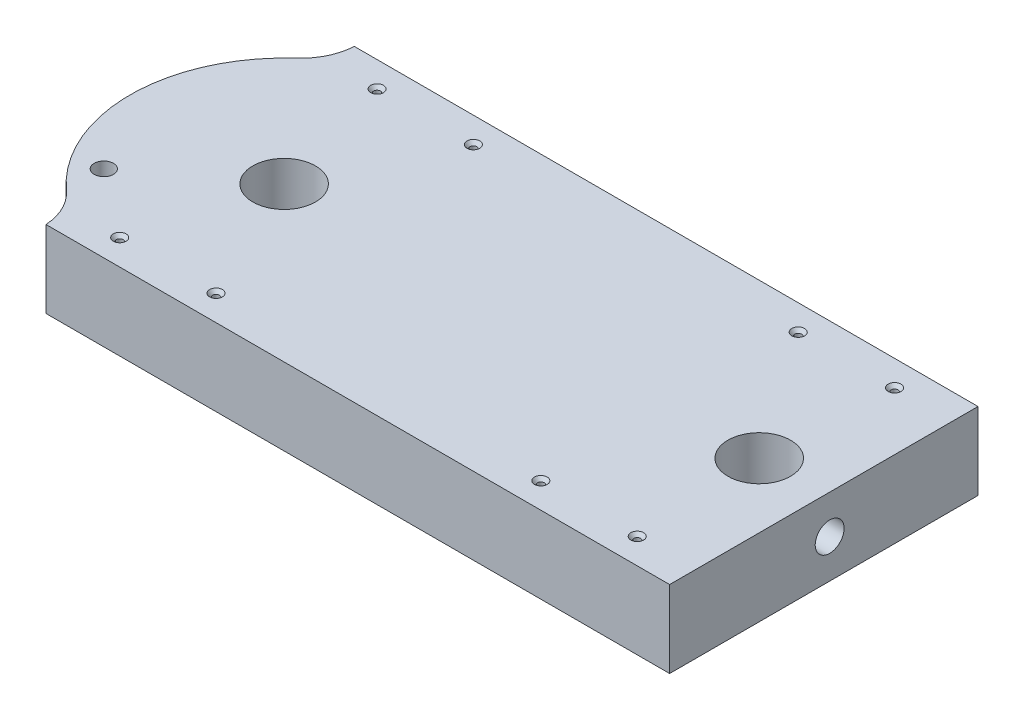
ISO-10303-21;
HEADER;
FILE_DESCRIPTION(('STEP AP214'),'2;1');
FILE_NAME('part.step','',(''),(''),'','','');
FILE_SCHEMA(('AUTOMOTIVE_DESIGN { 1 0 10303 214 1 1 1 1 }'));
ENDSEC;
DATA;
#1=APPLICATION_CONTEXT('core data for automotive mechanical design processes');
#2=APPLICATION_PROTOCOL_DEFINITION('international standard','automotive_design',2000,#1);
#3=PRODUCT_CONTEXT('',#1,'mechanical');
#4=PRODUCT('Part','Part','',(#3));
#5=PRODUCT_RELATED_PRODUCT_CATEGORY('part','',(#4));
#6=PRODUCT_DEFINITION_FORMATION('','',#4);
#7=PRODUCT_DEFINITION_CONTEXT('part definition',#1,'design');
#8=PRODUCT_DEFINITION('design','',#6,#7);
#9=PRODUCT_DEFINITION_SHAPE('','',#8);
#10=(LENGTH_UNIT() NAMED_UNIT(*) SI_UNIT(.MILLI.,.METRE.));
#11=(NAMED_UNIT(*) PLANE_ANGLE_UNIT() SI_UNIT($,.RADIAN.));
#12=(NAMED_UNIT(*) SI_UNIT($,.STERADIAN.) SOLID_ANGLE_UNIT());
#13=UNCERTAINTY_MEASURE_WITH_UNIT(LENGTH_MEASURE(1.E-05),#10,'distance_accuracy_value','');
#14=(GEOMETRIC_REPRESENTATION_CONTEXT(3) GLOBAL_UNCERTAINTY_ASSIGNED_CONTEXT((#13)) GLOBAL_UNIT_ASSIGNED_CONTEXT((#10,
#11,#12)) REPRESENTATION_CONTEXT('',''));
#15=CARTESIAN_POINT('',(0.,0.,0.));
#16=DIRECTION('',(0.,0.,1.));
#17=DIRECTION('',(1.,0.,0.));
#18=AXIS2_PLACEMENT_3D('',#15,#16,#17);
#19=CARTESIAN_POINT('',(-448.948604797529,50.8,205.533286209736));
#20=DIRECTION('',(0.,-1.,0.));
#21=DIRECTION('',(0.,0.,-1.));
#22=AXIS2_PLACEMENT_3D('',#19,#20,#21);
#23=CYLINDRICAL_SURFACE('',#22,38.1);
#24=CARTESIAN_POINT('',(-448.948604797529,0.,205.533286209736));
#25=DIRECTION('',(0.,1.,0.));
#26=DIRECTION('',(0.,0.,1.));
#27=AXIS2_PLACEMENT_3D('',#24,#25,#26);
#28=CIRCLE('',#27,38.1);
#29=CARTESIAN_POINT('',(-410.920118429236,0.,203.2));
#30=VERTEX_POINT('',#29);
#31=CARTESIAN_POINT('',(-423.489894398203,0.,177.187844516171));
#32=VERTEX_POINT('',#31);
#33=EDGE_CURVE('E125',#30,#32,#28,.T.);
#34=ORIENTED_EDGE('',*,*,#33,.F.);
#35=DIRECTION('',(0.,-1.,0.));
#36=VECTOR('',#35,1.);
#37=CARTESIAN_POINT('',(-410.920118429236,50.8,203.2));
#38=LINE('',#37,#36);
#39=CARTESIAN_POINT('',(-410.920118429236,50.8,203.2));
#40=VERTEX_POINT('',#39);
#41=EDGE_CURVE('E11',#40,#30,#38,.T.);
#42=ORIENTED_EDGE('',*,*,#41,.F.);
#43=CARTESIAN_POINT('',(-448.948604797529,50.8,205.533286209736));
#44=DIRECTION('',(0.,1.,0.));
#45=DIRECTION('',(0.,0.,1.));
#46=AXIS2_PLACEMENT_3D('',#43,#44,#45);
#47=CIRCLE('',#46,38.1);
#48=CARTESIAN_POINT('',(-423.489894398203,50.8,177.187844516171));
#49=VERTEX_POINT('',#48);
#50=EDGE_CURVE('E140',#40,#49,#47,.T.);
#51=ORIENTED_EDGE('',*,*,#50,.T.);
#52=DIRECTION('',(0.,-1.,0.));
#53=VECTOR('',#52,1.);
#54=CARTESIAN_POINT('',(-423.489894398203,50.8,177.187844516171));
#55=LINE('',#54,#53);
#56=EDGE_CURVE('E88',#49,#32,#55,.T.);
#57=ORIENTED_EDGE('',*,*,#56,.T.);
#58=EDGE_LOOP('',(#34,#42,#51,#57));
#59=FACE_BOUND('',#58,.T.);
#60=ADVANCED_FACE('F38',(#59),#23,.F.);
#61=CARTESIAN_POINT('',(0.,50.8,203.2));
#62=DIRECTION('',(0.,0.,1.));
#63=DIRECTION('',(1.,0.,0.));
#64=AXIS2_PLACEMENT_3D('',#61,#62,#63);
#65=PLANE('',#64);
#66=DIRECTION('',(-1.,0.,0.));
#67=VECTOR('',#66,1.);
#68=CARTESIAN_POINT('',(0.,0.,203.2));
#69=LINE('',#68,#67);
#70=CARTESIAN_POINT('',(0.,0.,203.2));
#71=VERTEX_POINT('',#70);
#72=EDGE_CURVE('E128',#71,#30,#69,.T.);
#73=ORIENTED_EDGE('',*,*,#72,.F.);
#74=DIRECTION('',(0.,-1.,0.));
#75=VECTOR('',#74,1.);
#76=CARTESIAN_POINT('',(0.,50.8,203.2));
#77=LINE('',#76,#75);
#78=CARTESIAN_POINT('',(0.,50.8,203.2));
#79=VERTEX_POINT('',#78);
#80=EDGE_CURVE('E52',#79,#71,#77,.T.);
#81=ORIENTED_EDGE('',*,*,#80,.F.);
#82=DIRECTION('',(-1.,0.,0.));
#83=VECTOR('',#82,1.);
#84=CARTESIAN_POINT('',(0.,50.8,203.2));
#85=LINE('',#84,#83);
#86=EDGE_CURVE('E154',#79,#40,#85,.T.);
#87=ORIENTED_EDGE('',*,*,#86,.T.);
#88=ORIENTED_EDGE('',*,*,#41,.T.);
#89=EDGE_LOOP('',(#73,#81,#87,#88));
#90=FACE_BOUND('',#89,.T.);
#91=ADVANCED_FACE('F150',(#90),#65,.T.);
#92=CARTESIAN_POINT('',(0.,50.8,0.));
#93=DIRECTION('',(1.,0.,0.));
#94=DIRECTION('',(0.,0.,-1.));
#95=AXIS2_PLACEMENT_3D('',#92,#93,#94);
#96=PLANE('',#95);
#97=CARTESIAN_POINT('',(0.,25.4,97.7392));
#98=DIRECTION('',(1.,0.,0.));
#99=DIRECTION('',(0.,0.,-1.));
#100=AXIS2_PLACEMENT_3D('',#97,#98,#99);
#101=CIRCLE('',#100,9.525);
#102=CARTESIAN_POINT('',(0.,25.4,88.2142));
#103=VERTEX_POINT('',#102);
#104=EDGE_CURVE('E247',#103,#103,#101,.T.);
#105=ORIENTED_EDGE('',*,*,#104,.F.);
#106=EDGE_LOOP('',(#105));
#107=FACE_BOUND('',#106,.T.);
#108=DIRECTION('',(0.,0.,1.));
#109=VECTOR('',#108,1.);
#110=CARTESIAN_POINT('',(0.,0.,0.));
#111=LINE('',#110,#109);
#112=CARTESIAN_POINT('',(0.,0.,0.));
#113=VERTEX_POINT('',#112);
#114=EDGE_CURVE('E132',#113,#71,#111,.T.);
#115=ORIENTED_EDGE('',*,*,#114,.F.);
#116=DIRECTION('',(0.,-1.,0.));
#117=VECTOR('',#116,1.);
#118=CARTESIAN_POINT('',(0.,50.8,0.));
#119=LINE('',#118,#117);
#120=CARTESIAN_POINT('',(0.,50.8,0.));
#121=VERTEX_POINT('',#120);
#122=EDGE_CURVE('E118',#121,#113,#119,.T.);
#123=ORIENTED_EDGE('',*,*,#122,.F.);
#124=DIRECTION('',(0.,0.,1.));
#125=VECTOR('',#124,1.);
#126=CARTESIAN_POINT('',(0.,50.8,0.));
#127=LINE('',#126,#125);
#128=EDGE_CURVE('E107',#121,#79,#127,.T.);
#129=ORIENTED_EDGE('',*,*,#128,.T.);
#130=ORIENTED_EDGE('',*,*,#80,.T.);
#131=EDGE_LOOP('',(#115,#123,#129,#130));
#132=FACE_BOUND('',#131,.T.);
#133=ADVANCED_FACE('F147',(#107,#132),#96,.T.);
#134=CARTESIAN_POINT('',(0.,50.8,0.));
#135=DIRECTION('',(0.,0.,1.));
#136=DIRECTION('',(1.,0.,0.));
#137=AXIS2_PLACEMENT_3D('',#134,#135,#136);
#138=PLANE('',#137);
#139=DIRECTION('',(-1.,0.,0.));
#140=VECTOR('',#139,1.);
#141=CARTESIAN_POINT('',(0.,0.,0.));
#142=LINE('',#141,#140);
#143=CARTESIAN_POINT('',(-410.920118429236,0.,0.));
#144=VERTEX_POINT('',#143);
#145=EDGE_CURVE('E114',#113,#144,#142,.T.);
#146=ORIENTED_EDGE('',*,*,#145,.T.);
#147=DIRECTION('',(0.,-1.,0.));
#148=VECTOR('',#147,1.);
#149=CARTESIAN_POINT('',(-410.920118429236,50.8,0.));
#150=LINE('',#149,#148);
#151=CARTESIAN_POINT('',(-410.920118429236,50.8,0.));
#152=VERTEX_POINT('',#151);
#153=EDGE_CURVE('E111',#152,#144,#150,.T.);
#154=ORIENTED_EDGE('',*,*,#153,.F.);
#155=DIRECTION('',(-1.,0.,0.));
#156=VECTOR('',#155,1.);
#157=CARTESIAN_POINT('',(0.,50.8,0.));
#158=LINE('',#157,#156);
#159=EDGE_CURVE('E100',#121,#152,#158,.T.);
#160=ORIENTED_EDGE('',*,*,#159,.F.);
#161=ORIENTED_EDGE('',*,*,#122,.T.);
#162=EDGE_LOOP('',(#146,#154,#160,#161));
#163=FACE_BOUND('',#162,.T.);
#164=ADVANCED_FACE('F112',(#163),#138,.F.);
#165=CARTESIAN_POINT('',(-448.948604797529,50.8,-2.33328620973551));
#166=DIRECTION('',(0.,-1.,0.));
#167=DIRECTION('',(0.,0.,-1.));
#168=AXIS2_PLACEMENT_3D('',#165,#166,#167);
#169=CYLINDRICAL_SURFACE('',#168,38.1);
#170=CARTESIAN_POINT('',(-448.948604797529,0.,-2.33328620973551));
#171=DIRECTION('',(0.,1.,0.));
#172=DIRECTION('',(0.,0.,1.));
#173=AXIS2_PLACEMENT_3D('',#170,#171,#172);
#174=CIRCLE('',#173,38.1);
#175=CARTESIAN_POINT('',(-423.489894398203,0.,26.0121554838287));
#176=VERTEX_POINT('',#175);
#177=EDGE_CURVE('E136',#176,#144,#174,.T.);
#178=ORIENTED_EDGE('',*,*,#177,.F.);
#179=DIRECTION('',(0.,-1.,0.));
#180=VECTOR('',#179,1.);
#181=CARTESIAN_POINT('',(-423.489894398203,50.8,26.0121554838287));
#182=LINE('',#181,#180);
#183=CARTESIAN_POINT('',(-423.489894398203,50.8,26.0121554838287));
#184=VERTEX_POINT('',#183);
#185=EDGE_CURVE('E81',#184,#176,#182,.T.);
#186=ORIENTED_EDGE('',*,*,#185,.F.);
#187=CARTESIAN_POINT('',(-448.948604797529,50.8,-2.33328620973551));
#188=DIRECTION('',(0.,1.,0.));
#189=DIRECTION('',(0.,0.,1.));
#190=AXIS2_PLACEMENT_3D('',#187,#188,#189);
#191=CIRCLE('',#190,38.1);
#192=EDGE_CURVE('E104',#184,#152,#191,.T.);
#193=ORIENTED_EDGE('',*,*,#192,.T.);
#194=ORIENTED_EDGE('',*,*,#153,.T.);
#195=EDGE_LOOP('',(#178,#186,#193,#194));
#196=FACE_BOUND('',#195,.T.);
#197=ADVANCED_FACE('F120',(#196),#169,.F.);
#198=CARTESIAN_POINT('',(-355.6,50.8,101.6));
#199=DIRECTION('',(0.,-1.,0.));
#200=DIRECTION('',(0.,0.,-1.));
#201=AXIS2_PLACEMENT_3D('',#198,#199,#200);
#202=CYLINDRICAL_SURFACE('',#201,101.6);
#203=CARTESIAN_POINT('',(-355.6,0.,101.6));
#204=DIRECTION('',(0.,1.,0.));
#205=DIRECTION('',(0.,0.,1.));
#206=AXIS2_PLACEMENT_3D('',#203,#204,#205);
#207=CIRCLE('',#206,101.6);
#208=EDGE_CURVE('E138',#176,#32,#207,.T.);
#209=ORIENTED_EDGE('',*,*,#208,.T.);
#210=ORIENTED_EDGE('',*,*,#56,.F.);
#211=CARTESIAN_POINT('',(-355.6,50.8,101.6));
#212=DIRECTION('',(0.,1.,0.));
#213=DIRECTION('',(0.,0.,1.));
#214=AXIS2_PLACEMENT_3D('',#211,#212,#213);
#215=CIRCLE('',#214,101.6);
#216=EDGE_CURVE('E60',#184,#49,#215,.T.);
#217=ORIENTED_EDGE('',*,*,#216,.F.);
#218=ORIENTED_EDGE('',*,*,#185,.T.);
#219=EDGE_LOOP('',(#209,#210,#217,#218));
#220=FACE_BOUND('',#219,.T.);
#221=ADVANCED_FACE('F153',(#220),#202,.T.);
#222=CARTESIAN_POINT('',(0.,50.8,0.));
#223=DIRECTION('',(0.,1.,0.));
#224=DIRECTION('',(0.,0.,1.));
#225=AXIS2_PLACEMENT_3D('',#222,#223,#224);
#226=PLANE('',#225);
#227=CARTESIAN_POINT('',(-42.545,50.8,101.6));
#228=DIRECTION('',(0.,1.,0.));
#229=DIRECTION('',(0.,0.,1.));
#230=AXIS2_PLACEMENT_3D('',#227,#228,#229);
#231=CIRCLE('',#230,20.6375);
#232=CARTESIAN_POINT('',(-42.545,50.8,122.2375));
#233=VERTEX_POINT('',#232);
#234=EDGE_CURVE('E242',#233,#233,#231,.T.);
#235=ORIENTED_EDGE('',*,*,#234,.F.);
#236=EDGE_LOOP('',(#235));
#237=FACE_BOUND('',#236,.T.);
#238=CARTESIAN_POINT('',(-355.6,50.8,101.6));
#239=DIRECTION('',(0.,1.,0.));
#240=DIRECTION('',(0.,0.,1.));
#241=AXIS2_PLACEMENT_3D('',#238,#239,#240);
#242=CIRCLE('',#241,20.6375);
#243=CARTESIAN_POINT('',(-355.6,50.8,122.2375));
#244=VERTEX_POINT('',#243);
#245=EDGE_CURVE('E236',#244,#244,#242,.T.);
#246=ORIENTED_EDGE('',*,*,#245,.F.);
#247=EDGE_LOOP('',(#246));
#248=FACE_BOUND('',#247,.T.);
#249=CARTESIAN_POINT('',(-423.620118429236,50.8,152.4));
#250=DIRECTION('',(0.,1.,0.));
#251=DIRECTION('',(0.,0.,1.));
#252=AXIS2_PLACEMENT_3D('',#249,#250,#251);
#253=CIRCLE('',#252,6.34999999999994);
#254=CARTESIAN_POINT('',(-423.620118429236,50.8,158.75));
#255=VERTEX_POINT('',#254);
#256=EDGE_CURVE('E230',#255,#255,#253,.T.);
#257=ORIENTED_EDGE('',*,*,#256,.F.);
#258=EDGE_LOOP('',(#257));
#259=FACE_BOUND('',#258,.T.);
#260=CARTESIAN_POINT('',(-38.1518815707644,50.8,16.8148));
#261=DIRECTION('',(0.,1.,0.));
#262=DIRECTION('',(0.,0.,1.));
#263=AXIS2_PLACEMENT_3D('',#260,#261,#262);
#264=CIRCLE('',#263,4.2164);
#265=CARTESIAN_POINT('',(-38.1518815707644,50.8,21.0312));
#266=VERTEX_POINT('',#265);
#267=EDGE_CURVE('E226',#266,#266,#264,.T.);
#268=ORIENTED_EDGE('',*,*,#267,.F.);
#269=EDGE_LOOP('',(#268));
#270=FACE_BOUND('',#269,.T.);
#271=CARTESIAN_POINT('',(-101.651881570764,50.8,16.8148000000001));
#272=DIRECTION('',(0.,1.,0.));
#273=DIRECTION('',(0.,0.,1.));
#274=AXIS2_PLACEMENT_3D('',#271,#272,#273);
#275=CIRCLE('',#274,4.21639999999999);
#276=CARTESIAN_POINT('',(-101.651881570764,50.8,21.0312000000001));
#277=VERTEX_POINT('',#276);
#278=EDGE_CURVE('E217',#277,#277,#275,.T.);
#279=ORIENTED_EDGE('',*,*,#278,.F.);
#280=EDGE_LOOP('',(#279));
#281=FACE_BOUND('',#280,.T.);
#282=CARTESIAN_POINT('',(-38.1518815707644,50.8,186.3852));
#283=DIRECTION('',(0.,1.,0.));
#284=DIRECTION('',(0.,0.,1.));
#285=AXIS2_PLACEMENT_3D('',#282,#283,#284);
#286=CIRCLE('',#285,4.2164);
#287=CARTESIAN_POINT('',(-38.1518815707644,50.8,190.6016));
#288=VERTEX_POINT('',#287);
#289=EDGE_CURVE('E208',#288,#288,#286,.T.);
#290=ORIENTED_EDGE('',*,*,#289,.F.);
#291=EDGE_LOOP('',(#290));
#292=FACE_BOUND('',#291,.T.);
#293=CARTESIAN_POINT('',(-101.651881570764,50.8,186.3852));
#294=DIRECTION('',(0.,1.,0.));
#295=DIRECTION('',(0.,0.,1.));
#296=AXIS2_PLACEMENT_3D('',#293,#294,#295);
#297=CIRCLE('',#296,4.21639999999999);
#298=CARTESIAN_POINT('',(-101.651881570764,50.8,190.6016));
#299=VERTEX_POINT('',#298);
#300=EDGE_CURVE('E199',#299,#299,#297,.T.);
#301=ORIENTED_EDGE('',*,*,#300,.F.);
#302=EDGE_LOOP('',(#301));
#303=FACE_BOUND('',#302,.T.);
#304=CARTESIAN_POINT('',(-379.170118429236,50.8,16.8148));
#305=DIRECTION('',(0.,1.,0.));
#306=DIRECTION('',(0.,0.,1.));
#307=AXIS2_PLACEMENT_3D('',#304,#305,#306);
#308=CIRCLE('',#307,4.21640000000001);
#309=CARTESIAN_POINT('',(-379.170118429236,50.8,21.0312));
#310=VERTEX_POINT('',#309);
#311=EDGE_CURVE('E190',#310,#310,#308,.T.);
#312=ORIENTED_EDGE('',*,*,#311,.F.);
#313=EDGE_LOOP('',(#312));
#314=FACE_BOUND('',#313,.T.);
#315=CARTESIAN_POINT('',(-315.670118429236,50.8,16.8148000000001));
#316=DIRECTION('',(0.,1.,0.));
#317=DIRECTION('',(0.,0.,1.));
#318=AXIS2_PLACEMENT_3D('',#315,#316,#317);
#319=CIRCLE('',#318,4.21640000000001);
#320=CARTESIAN_POINT('',(-315.670118429236,50.8,21.0312000000001));
#321=VERTEX_POINT('',#320);
#322=EDGE_CURVE('E181',#321,#321,#319,.T.);
#323=ORIENTED_EDGE('',*,*,#322,.F.);
#324=EDGE_LOOP('',(#323));
#325=FACE_BOUND('',#324,.T.);
#326=CARTESIAN_POINT('',(-379.170118429236,50.8,186.3852));
#327=DIRECTION('',(0.,1.,0.));
#328=DIRECTION('',(0.,0.,1.));
#329=AXIS2_PLACEMENT_3D('',#326,#327,#328);
#330=CIRCLE('',#329,4.21640000000001);
#331=CARTESIAN_POINT('',(-379.170118429236,50.8,190.6016));
#332=VERTEX_POINT('',#331);
#333=EDGE_CURVE('E172',#332,#332,#330,.T.);
#334=ORIENTED_EDGE('',*,*,#333,.F.);
#335=EDGE_LOOP('',(#334));
#336=FACE_BOUND('',#335,.T.);
#337=CARTESIAN_POINT('',(-315.670118429236,50.8,186.3852));
#338=DIRECTION('',(0.,1.,0.));
#339=DIRECTION('',(0.,0.,1.));
#340=AXIS2_PLACEMENT_3D('',#337,#338,#339);
#341=CIRCLE('',#340,4.21640000000001);
#342=CARTESIAN_POINT('',(-315.670118429236,50.8,190.6016));
#343=VERTEX_POINT('',#342);
#344=EDGE_CURVE('E163',#343,#343,#341,.T.);
#345=ORIENTED_EDGE('',*,*,#344,.F.);
#346=EDGE_LOOP('',(#345));
#347=FACE_BOUND('',#346,.T.);
#348=ORIENTED_EDGE('',*,*,#50,.F.);
#349=ORIENTED_EDGE('',*,*,#86,.F.);
#350=ORIENTED_EDGE('',*,*,#128,.F.);
#351=ORIENTED_EDGE('',*,*,#159,.T.);
#352=ORIENTED_EDGE('',*,*,#192,.F.);
#353=ORIENTED_EDGE('',*,*,#216,.T.);
#354=EDGE_LOOP('',(#348,#349,#350,#351,#352,#353));
#355=FACE_BOUND('',#354,.T.);
#356=ADVANCED_FACE('F102',(#237,#248,#259,#270,#281,#292,#303,#314,#325,#336,#347,#355),#226,.T.);
#357=CARTESIAN_POINT('',(0.,0.,0.));
#358=DIRECTION('',(0.,1.,0.));
#359=DIRECTION('',(0.,0.,1.));
#360=AXIS2_PLACEMENT_3D('',#357,#358,#359);
#361=PLANE('',#360);
#362=CARTESIAN_POINT('',(-42.545,0.,101.6));
#363=DIRECTION('',(0.,1.,0.));
#364=DIRECTION('',(0.,0.,1.));
#365=AXIS2_PLACEMENT_3D('',#362,#363,#364);
#366=CIRCLE('',#365,20.6375);
#367=CARTESIAN_POINT('',(-42.545,0.,122.2375));
#368=VERTEX_POINT('',#367);
#369=EDGE_CURVE('E239',#368,#368,#366,.T.);
#370=ORIENTED_EDGE('',*,*,#369,.T.);
#371=EDGE_LOOP('',(#370));
#372=FACE_BOUND('',#371,.T.);
#373=CARTESIAN_POINT('',(-355.6,0.,101.6));
#374=DIRECTION('',(0.,1.,0.));
#375=DIRECTION('',(0.,0.,1.));
#376=AXIS2_PLACEMENT_3D('',#373,#374,#375);
#377=CIRCLE('',#376,20.6375);
#378=CARTESIAN_POINT('',(-355.6,0.,122.2375));
#379=VERTEX_POINT('',#378);
#380=EDGE_CURVE('E233',#379,#379,#377,.T.);
#381=ORIENTED_EDGE('',*,*,#380,.T.);
#382=EDGE_LOOP('',(#381));
#383=FACE_BOUND('',#382,.T.);
#384=CARTESIAN_POINT('',(-423.620118429236,0.,152.4));
#385=DIRECTION('',(0.,1.,0.));
#386=DIRECTION('',(0.,0.,1.));
#387=AXIS2_PLACEMENT_3D('',#384,#385,#386);
#388=CIRCLE('',#387,6.34999999999994);
#389=CARTESIAN_POINT('',(-423.620118429236,0.,158.75));
#390=VERTEX_POINT('',#389);
#391=EDGE_CURVE('E229',#390,#390,#388,.T.);
#392=ORIENTED_EDGE('',*,*,#391,.T.);
#393=EDGE_LOOP('',(#392));
#394=FACE_BOUND('',#393,.T.);
#395=CARTESIAN_POINT('',(-38.1518815707644,0.,16.8148));
#396=DIRECTION('',(0.,1.,0.));
#397=DIRECTION('',(0.,0.,1.));
#398=AXIS2_PLACEMENT_3D('',#395,#396,#397);
#399=CIRCLE('',#398,2.24789999999998);
#400=CARTESIAN_POINT('',(-38.1518815707644,0.,19.0627));
#401=VERTEX_POINT('',#400);
#402=EDGE_CURVE('E220',#401,#401,#399,.T.);
#403=ORIENTED_EDGE('',*,*,#402,.T.);
#404=EDGE_LOOP('',(#403));
#405=FACE_BOUND('',#404,.T.);
#406=CARTESIAN_POINT('',(-101.651881570764,0.,16.8148000000001));
#407=DIRECTION('',(0.,1.,0.));
#408=DIRECTION('',(0.,0.,1.));
#409=AXIS2_PLACEMENT_3D('',#406,#407,#408);
#410=CIRCLE('',#409,2.24789999999998);
#411=CARTESIAN_POINT('',(-101.651881570764,0.,19.0627000000001));
#412=VERTEX_POINT('',#411);
#413=EDGE_CURVE('E211',#412,#412,#410,.T.);
#414=ORIENTED_EDGE('',*,*,#413,.T.);
#415=EDGE_LOOP('',(#414));
#416=FACE_BOUND('',#415,.T.);
#417=CARTESIAN_POINT('',(-38.1518815707644,0.,186.3852));
#418=DIRECTION('',(0.,1.,0.));
#419=DIRECTION('',(0.,0.,1.));
#420=AXIS2_PLACEMENT_3D('',#417,#418,#419);
#421=CIRCLE('',#420,2.24789999999998);
#422=CARTESIAN_POINT('',(-38.1518815707644,0.,188.6331));
#423=VERTEX_POINT('',#422);
#424=EDGE_CURVE('E202',#423,#423,#421,.T.);
#425=ORIENTED_EDGE('',*,*,#424,.T.);
#426=EDGE_LOOP('',(#425));
#427=FACE_BOUND('',#426,.T.);
#428=CARTESIAN_POINT('',(-101.651881570764,0.,186.3852));
#429=DIRECTION('',(0.,1.,0.));
#430=DIRECTION('',(0.,0.,1.));
#431=AXIS2_PLACEMENT_3D('',#428,#429,#430);
#432=CIRCLE('',#431,2.24789999999998);
#433=CARTESIAN_POINT('',(-101.651881570764,0.,188.6331));
#434=VERTEX_POINT('',#433);
#435=EDGE_CURVE('E193',#434,#434,#432,.T.);
#436=ORIENTED_EDGE('',*,*,#435,.T.);
#437=EDGE_LOOP('',(#436));
#438=FACE_BOUND('',#437,.T.);
#439=CARTESIAN_POINT('',(-379.170118429236,0.,16.8148));
#440=DIRECTION('',(0.,1.,0.));
#441=DIRECTION('',(0.,0.,1.));
#442=AXIS2_PLACEMENT_3D('',#439,#440,#441);
#443=CIRCLE('',#442,2.24789999999997);
#444=CARTESIAN_POINT('',(-379.170118429236,0.,19.0627));
#445=VERTEX_POINT('',#444);
#446=EDGE_CURVE('E184',#445,#445,#443,.T.);
#447=ORIENTED_EDGE('',*,*,#446,.T.);
#448=EDGE_LOOP('',(#447));
#449=FACE_BOUND('',#448,.T.);
#450=CARTESIAN_POINT('',(-315.670118429236,0.,16.8148000000001));
#451=DIRECTION('',(0.,1.,0.));
#452=DIRECTION('',(0.,0.,1.));
#453=AXIS2_PLACEMENT_3D('',#450,#451,#452);
#454=CIRCLE('',#453,2.24789999999997);
#455=CARTESIAN_POINT('',(-315.670118429236,0.,19.0627000000001));
#456=VERTEX_POINT('',#455);
#457=EDGE_CURVE('E175',#456,#456,#454,.T.);
#458=ORIENTED_EDGE('',*,*,#457,.T.);
#459=EDGE_LOOP('',(#458));
#460=FACE_BOUND('',#459,.T.);
#461=CARTESIAN_POINT('',(-379.170118429236,0.,186.3852));
#462=DIRECTION('',(0.,1.,0.));
#463=DIRECTION('',(0.,0.,1.));
#464=AXIS2_PLACEMENT_3D('',#461,#462,#463);
#465=CIRCLE('',#464,2.24789999999997);
#466=CARTESIAN_POINT('',(-379.170118429236,0.,188.6331));
#467=VERTEX_POINT('',#466);
#468=EDGE_CURVE('E166',#467,#467,#465,.T.);
#469=ORIENTED_EDGE('',*,*,#468,.T.);
#470=EDGE_LOOP('',(#469));
#471=FACE_BOUND('',#470,.T.);
#472=CARTESIAN_POINT('',(-315.670118429236,0.,186.3852));
#473=DIRECTION('',(0.,1.,0.));
#474=DIRECTION('',(0.,0.,1.));
#475=AXIS2_PLACEMENT_3D('',#472,#473,#474);
#476=CIRCLE('',#475,2.24789999999997);
#477=CARTESIAN_POINT('',(-315.670118429236,0.,188.6331));
#478=VERTEX_POINT('',#477);
#479=EDGE_CURVE('E129',#478,#478,#476,.T.);
#480=ORIENTED_EDGE('',*,*,#479,.T.);
#481=EDGE_LOOP('',(#480));
#482=FACE_BOUND('',#481,.T.);
#483=ORIENTED_EDGE('',*,*,#33,.T.);
#484=ORIENTED_EDGE('',*,*,#208,.F.);
#485=ORIENTED_EDGE('',*,*,#177,.T.);
#486=ORIENTED_EDGE('',*,*,#145,.F.);
#487=ORIENTED_EDGE('',*,*,#114,.T.);
#488=ORIENTED_EDGE('',*,*,#72,.T.);
#489=EDGE_LOOP('',(#483,#484,#485,#486,#487,#488));
#490=FACE_BOUND('',#489,.T.);
#491=ADVANCED_FACE('F152',(#372,#383,#394,#405,#416,#427,#438,#449,#460,#471,#482,#490),#361,.F.);
#492=CARTESIAN_POINT('',(-315.670118429236,50.8,186.3852));
#493=DIRECTION('',(0.,1.,0.));
#494=DIRECTION('',(0.,0.,1.));
#495=AXIS2_PLACEMENT_3D('',#492,#493,#494);
#496=CYLINDRICAL_SURFACE('',#495,2.24789999999997);
#497=ORIENTED_EDGE('',*,*,#479,.F.);
#498=EDGE_LOOP('',(#497));
#499=FACE_BOUND('',#498,.T.);
#500=CARTESIAN_POINT('',(-315.670118429236,48.5354997903854,186.3852));
#501=DIRECTION('',(0.,1.,0.));
#502=DIRECTION('',(0.,0.,1.));
#503=AXIS2_PLACEMENT_3D('',#500,#501,#502);
#504=CIRCLE('',#503,2.24789999999997);
#505=CARTESIAN_POINT('',(-315.670118429236,48.5354997903854,188.6331));
#506=VERTEX_POINT('',#505);
#507=EDGE_CURVE('E160',#506,#506,#504,.T.);
#508=ORIENTED_EDGE('',*,*,#507,.T.);
#509=EDGE_LOOP('',(#508));
#510=FACE_BOUND('',#509,.T.);
#511=ADVANCED_FACE('F282',(#499,#510),#496,.F.);
#512=CARTESIAN_POINT('',(-315.670118429236,50.8,186.3852));
#513=DIRECTION('',(0.,1.,0.));
#514=DIRECTION('',(0.,0.,1.));
#515=AXIS2_PLACEMENT_3D('',#512,#513,#514);
#516=CONICAL_SURFACE('',#515,4.21640000000001,0.715584993317684);
#517=ORIENTED_EDGE('',*,*,#507,.F.);
#518=EDGE_LOOP('',(#517));
#519=FACE_BOUND('',#518,.T.);
#520=ORIENTED_EDGE('',*,*,#344,.T.);
#521=EDGE_LOOP('',(#520));
#522=FACE_BOUND('',#521,.T.);
#523=ADVANCED_FACE('F289',(#519,#522),#516,.F.);
#524=CARTESIAN_POINT('',(-379.170118429236,50.8,186.3852));
#525=DIRECTION('',(0.,1.,0.));
#526=DIRECTION('',(0.,0.,1.));
#527=AXIS2_PLACEMENT_3D('',#524,#525,#526);
#528=CYLINDRICAL_SURFACE('',#527,2.24789999999997);
#529=ORIENTED_EDGE('',*,*,#468,.F.);
#530=EDGE_LOOP('',(#529));
#531=FACE_BOUND('',#530,.T.);
#532=CARTESIAN_POINT('',(-379.170118429236,48.5354997903854,186.3852));
#533=DIRECTION('',(0.,1.,0.));
#534=DIRECTION('',(0.,0.,1.));
#535=AXIS2_PLACEMENT_3D('',#532,#533,#534);
#536=CIRCLE('',#535,2.24789999999997);
#537=CARTESIAN_POINT('',(-379.170118429236,48.5354997903854,188.6331));
#538=VERTEX_POINT('',#537);
#539=EDGE_CURVE('E169',#538,#538,#536,.T.);
#540=ORIENTED_EDGE('',*,*,#539,.T.);
#541=EDGE_LOOP('',(#540));
#542=FACE_BOUND('',#541,.T.);
#543=ADVANCED_FACE('F293',(#531,#542),#528,.F.);
#544=CARTESIAN_POINT('',(-379.170118429236,50.8,186.3852));
#545=DIRECTION('',(0.,1.,0.));
#546=DIRECTION('',(0.,0.,1.));
#547=AXIS2_PLACEMENT_3D('',#544,#545,#546);
#548=CONICAL_SURFACE('',#547,4.21640000000001,0.715584993317684);
#549=ORIENTED_EDGE('',*,*,#539,.F.);
#550=EDGE_LOOP('',(#549));
#551=FACE_BOUND('',#550,.T.);
#552=ORIENTED_EDGE('',*,*,#333,.T.);
#553=EDGE_LOOP('',(#552));
#554=FACE_BOUND('',#553,.T.);
#555=ADVANCED_FACE('F297',(#551,#554),#548,.F.);
#556=CARTESIAN_POINT('',(-315.670118429236,50.8,16.8148000000001));
#557=DIRECTION('',(0.,1.,0.));
#558=DIRECTION('',(0.,0.,1.));
#559=AXIS2_PLACEMENT_3D('',#556,#557,#558);
#560=CYLINDRICAL_SURFACE('',#559,2.24789999999997);
#561=ORIENTED_EDGE('',*,*,#457,.F.);
#562=EDGE_LOOP('',(#561));
#563=FACE_BOUND('',#562,.T.);
#564=CARTESIAN_POINT('',(-315.670118429236,48.5354997903854,16.8148000000001));
#565=DIRECTION('',(0.,1.,0.));
#566=DIRECTION('',(0.,0.,1.));
#567=AXIS2_PLACEMENT_3D('',#564,#565,#566);
#568=CIRCLE('',#567,2.24789999999997);
#569=CARTESIAN_POINT('',(-315.670118429236,48.5354997903854,19.0627000000001));
#570=VERTEX_POINT('',#569);
#571=EDGE_CURVE('E178',#570,#570,#568,.T.);
#572=ORIENTED_EDGE('',*,*,#571,.T.);
#573=EDGE_LOOP('',(#572));
#574=FACE_BOUND('',#573,.T.);
#575=ADVANCED_FACE('F301',(#563,#574),#560,.F.);
#576=CARTESIAN_POINT('',(-315.670118429236,50.8,16.8148000000001));
#577=DIRECTION('',(0.,1.,0.));
#578=DIRECTION('',(0.,0.,1.));
#579=AXIS2_PLACEMENT_3D('',#576,#577,#578);
#580=CONICAL_SURFACE('',#579,4.21640000000001,0.715584993317684);
#581=ORIENTED_EDGE('',*,*,#571,.F.);
#582=EDGE_LOOP('',(#581));
#583=FACE_BOUND('',#582,.T.);
#584=ORIENTED_EDGE('',*,*,#322,.T.);
#585=EDGE_LOOP('',(#584));
#586=FACE_BOUND('',#585,.T.);
#587=ADVANCED_FACE('F305',(#583,#586),#580,.F.);
#588=CARTESIAN_POINT('',(-379.170118429236,50.8,16.8148));
#589=DIRECTION('',(0.,1.,0.));
#590=DIRECTION('',(0.,0.,1.));
#591=AXIS2_PLACEMENT_3D('',#588,#589,#590);
#592=CYLINDRICAL_SURFACE('',#591,2.24789999999997);
#593=ORIENTED_EDGE('',*,*,#446,.F.);
#594=EDGE_LOOP('',(#593));
#595=FACE_BOUND('',#594,.T.);
#596=CARTESIAN_POINT('',(-379.170118429236,48.5354997903854,16.8148));
#597=DIRECTION('',(0.,1.,0.));
#598=DIRECTION('',(0.,0.,1.));
#599=AXIS2_PLACEMENT_3D('',#596,#597,#598);
#600=CIRCLE('',#599,2.24789999999997);
#601=CARTESIAN_POINT('',(-379.170118429236,48.5354997903854,19.0627));
#602=VERTEX_POINT('',#601);
#603=EDGE_CURVE('E187',#602,#602,#600,.T.);
#604=ORIENTED_EDGE('',*,*,#603,.T.);
#605=EDGE_LOOP('',(#604));
#606=FACE_BOUND('',#605,.T.);
#607=ADVANCED_FACE('F309',(#595,#606),#592,.F.);
#608=CARTESIAN_POINT('',(-379.170118429236,50.8,16.8148));
#609=DIRECTION('',(0.,1.,0.));
#610=DIRECTION('',(0.,0.,1.));
#611=AXIS2_PLACEMENT_3D('',#608,#609,#610);
#612=CONICAL_SURFACE('',#611,4.21640000000001,0.715584993317684);
#613=ORIENTED_EDGE('',*,*,#603,.F.);
#614=EDGE_LOOP('',(#613));
#615=FACE_BOUND('',#614,.T.);
#616=ORIENTED_EDGE('',*,*,#311,.T.);
#617=EDGE_LOOP('',(#616));
#618=FACE_BOUND('',#617,.T.);
#619=ADVANCED_FACE('F313',(#615,#618),#612,.F.);
#620=CARTESIAN_POINT('',(-101.651881570764,50.8,186.3852));
#621=DIRECTION('',(0.,1.,0.));
#622=DIRECTION('',(0.,0.,1.));
#623=AXIS2_PLACEMENT_3D('',#620,#621,#622);
#624=CYLINDRICAL_SURFACE('',#623,2.24789999999999);
#625=ORIENTED_EDGE('',*,*,#435,.F.);
#626=EDGE_LOOP('',(#625));
#627=FACE_BOUND('',#626,.T.);
#628=CARTESIAN_POINT('',(-101.651881570764,48.5354997903854,186.3852));
#629=DIRECTION('',(0.,1.,0.));
#630=DIRECTION('',(0.,0.,1.));
#631=AXIS2_PLACEMENT_3D('',#628,#629,#630);
#632=CIRCLE('',#631,2.2479);
#633=CARTESIAN_POINT('',(-101.651881570764,48.5354997903854,188.6331));
#634=VERTEX_POINT('',#633);
#635=EDGE_CURVE('E196',#634,#634,#632,.T.);
#636=ORIENTED_EDGE('',*,*,#635,.T.);
#637=EDGE_LOOP('',(#636));
#638=FACE_BOUND('',#637,.T.);
#639=ADVANCED_FACE('F317',(#627,#638),#624,.F.);
#640=CARTESIAN_POINT('',(-101.651881570764,50.8,186.3852));
#641=DIRECTION('',(0.,1.,0.));
#642=DIRECTION('',(0.,0.,1.));
#643=AXIS2_PLACEMENT_3D('',#640,#641,#642);
#644=CONICAL_SURFACE('',#643,4.21639999999999,0.715584993317673);
#645=ORIENTED_EDGE('',*,*,#635,.F.);
#646=EDGE_LOOP('',(#645));
#647=FACE_BOUND('',#646,.T.);
#648=ORIENTED_EDGE('',*,*,#300,.T.);
#649=EDGE_LOOP('',(#648));
#650=FACE_BOUND('',#649,.T.);
#651=ADVANCED_FACE('F321',(#647,#650),#644,.F.);
#652=CARTESIAN_POINT('',(-38.1518815707644,50.8,186.3852));
#653=DIRECTION('',(0.,1.,0.));
#654=DIRECTION('',(0.,0.,1.));
#655=AXIS2_PLACEMENT_3D('',#652,#653,#654);
#656=CYLINDRICAL_SURFACE('',#655,2.24789999999999);
#657=ORIENTED_EDGE('',*,*,#424,.F.);
#658=EDGE_LOOP('',(#657));
#659=FACE_BOUND('',#658,.T.);
#660=CARTESIAN_POINT('',(-38.1518815707644,48.5354997903854,186.3852));
#661=DIRECTION('',(0.,1.,0.));
#662=DIRECTION('',(0.,0.,1.));
#663=AXIS2_PLACEMENT_3D('',#660,#661,#662);
#664=CIRCLE('',#663,2.24789999999999);
#665=CARTESIAN_POINT('',(-38.1518815707644,48.5354997903854,188.6331));
#666=VERTEX_POINT('',#665);
#667=EDGE_CURVE('E205',#666,#666,#664,.T.);
#668=ORIENTED_EDGE('',*,*,#667,.T.);
#669=EDGE_LOOP('',(#668));
#670=FACE_BOUND('',#669,.T.);
#671=ADVANCED_FACE('F325',(#659,#670),#656,.F.);
#672=CARTESIAN_POINT('',(-38.1518815707644,50.8,186.3852));
#673=DIRECTION('',(0.,1.,0.));
#674=DIRECTION('',(0.,0.,1.));
#675=AXIS2_PLACEMENT_3D('',#672,#673,#674);
#676=CONICAL_SURFACE('',#675,4.2164,0.715584993317677);
#677=ORIENTED_EDGE('',*,*,#667,.F.);
#678=EDGE_LOOP('',(#677));
#679=FACE_BOUND('',#678,.T.);
#680=ORIENTED_EDGE('',*,*,#289,.T.);
#681=EDGE_LOOP('',(#680));
#682=FACE_BOUND('',#681,.T.);
#683=ADVANCED_FACE('F329',(#679,#682),#676,.F.);
#684=CARTESIAN_POINT('',(-101.651881570764,50.8,16.8148000000001));
#685=DIRECTION('',(0.,1.,0.));
#686=DIRECTION('',(0.,0.,1.));
#687=AXIS2_PLACEMENT_3D('',#684,#685,#686);
#688=CYLINDRICAL_SURFACE('',#687,2.24789999999999);
#689=ORIENTED_EDGE('',*,*,#413,.F.);
#690=EDGE_LOOP('',(#689));
#691=FACE_BOUND('',#690,.T.);
#692=CARTESIAN_POINT('',(-101.651881570764,48.5354997903854,16.8148000000001));
#693=DIRECTION('',(0.,1.,0.));
#694=DIRECTION('',(0.,0.,1.));
#695=AXIS2_PLACEMENT_3D('',#692,#693,#694);
#696=CIRCLE('',#695,2.2479);
#697=CARTESIAN_POINT('',(-101.651881570764,48.5354997903854,19.0627000000001));
#698=VERTEX_POINT('',#697);
#699=EDGE_CURVE('E214',#698,#698,#696,.T.);
#700=ORIENTED_EDGE('',*,*,#699,.T.);
#701=EDGE_LOOP('',(#700));
#702=FACE_BOUND('',#701,.T.);
#703=ADVANCED_FACE('F333',(#691,#702),#688,.F.);
#704=CARTESIAN_POINT('',(-101.651881570764,50.8,16.8148000000001));
#705=DIRECTION('',(0.,1.,0.));
#706=DIRECTION('',(0.,0.,1.));
#707=AXIS2_PLACEMENT_3D('',#704,#705,#706);
#708=CONICAL_SURFACE('',#707,4.21639999999999,0.715584993317673);
#709=ORIENTED_EDGE('',*,*,#699,.F.);
#710=EDGE_LOOP('',(#709));
#711=FACE_BOUND('',#710,.T.);
#712=ORIENTED_EDGE('',*,*,#278,.T.);
#713=EDGE_LOOP('',(#712));
#714=FACE_BOUND('',#713,.T.);
#715=ADVANCED_FACE('F337',(#711,#714),#708,.F.);
#716=CARTESIAN_POINT('',(-38.1518815707644,50.8,16.8148));
#717=DIRECTION('',(0.,1.,0.));
#718=DIRECTION('',(0.,0.,1.));
#719=AXIS2_PLACEMENT_3D('',#716,#717,#718);
#720=CYLINDRICAL_SURFACE('',#719,2.24789999999999);
#721=ORIENTED_EDGE('',*,*,#402,.F.);
#722=EDGE_LOOP('',(#721));
#723=FACE_BOUND('',#722,.T.);
#724=CARTESIAN_POINT('',(-38.1518815707644,48.5354997903854,16.8148));
#725=DIRECTION('',(0.,1.,0.));
#726=DIRECTION('',(0.,0.,1.));
#727=AXIS2_PLACEMENT_3D('',#724,#725,#726);
#728=CIRCLE('',#727,2.24789999999999);
#729=CARTESIAN_POINT('',(-38.1518815707644,48.5354997903854,19.0627));
#730=VERTEX_POINT('',#729);
#731=EDGE_CURVE('E223',#730,#730,#728,.T.);
#732=ORIENTED_EDGE('',*,*,#731,.T.);
#733=EDGE_LOOP('',(#732));
#734=FACE_BOUND('',#733,.T.);
#735=ADVANCED_FACE('F341',(#723,#734),#720,.F.);
#736=CARTESIAN_POINT('',(-38.1518815707644,50.8,16.8148));
#737=DIRECTION('',(0.,1.,0.));
#738=DIRECTION('',(0.,0.,1.));
#739=AXIS2_PLACEMENT_3D('',#736,#737,#738);
#740=CONICAL_SURFACE('',#739,4.2164,0.715584993317677);
#741=ORIENTED_EDGE('',*,*,#731,.F.);
#742=EDGE_LOOP('',(#741));
#743=FACE_BOUND('',#742,.T.);
#744=ORIENTED_EDGE('',*,*,#267,.T.);
#745=EDGE_LOOP('',(#744));
#746=FACE_BOUND('',#745,.T.);
#747=ADVANCED_FACE('F345',(#743,#746),#740,.F.);
#748=CARTESIAN_POINT('',(-423.620118429236,0.,152.4));
#749=DIRECTION('',(0.,1.,0.));
#750=DIRECTION('',(0.,0.,1.));
#751=AXIS2_PLACEMENT_3D('',#748,#749,#750);
#752=CYLINDRICAL_SURFACE('',#751,6.34999999999994);
#753=ORIENTED_EDGE('',*,*,#391,.F.);
#754=EDGE_LOOP('',(#753));
#755=FACE_BOUND('',#754,.T.);
#756=ORIENTED_EDGE('',*,*,#256,.T.);
#757=EDGE_LOOP('',(#756));
#758=FACE_BOUND('',#757,.T.);
#759=ADVANCED_FACE('F349',(#755,#758),#752,.F.);
#760=CARTESIAN_POINT('',(-355.6,0.,101.6));
#761=DIRECTION('',(0.,1.,0.));
#762=DIRECTION('',(0.,0.,1.));
#763=AXIS2_PLACEMENT_3D('',#760,#761,#762);
#764=CYLINDRICAL_SURFACE('',#763,20.6375);
#765=ORIENTED_EDGE('',*,*,#380,.F.);
#766=EDGE_LOOP('',(#765));
#767=FACE_BOUND('',#766,.T.);
#768=ORIENTED_EDGE('',*,*,#245,.T.);
#769=EDGE_LOOP('',(#768));
#770=FACE_BOUND('',#769,.T.);
#771=ADVANCED_FACE('F262',(#767,#770),#764,.F.);
#772=CARTESIAN_POINT('',(-42.545,0.,101.6));
#773=DIRECTION('',(0.,1.,0.));
#774=DIRECTION('',(0.,0.,1.));
#775=AXIS2_PLACEMENT_3D('',#772,#773,#774);
#776=CYLINDRICAL_SURFACE('',#775,20.6375);
#777=CARTESIAN_POINT('',(-26.8374615356192,25.4,88.2142));
#778=CARTESIAN_POINT('',(-26.8374626980459,25.6311706415493,88.2141992080606));
#779=CARTESIAN_POINT('',(-26.830266103646,25.8623316277521,88.2226298635802));
#780=CARTESIAN_POINT('',(-26.8017656457958,26.3226509796652,88.2561826886187));
#781=CARTESIAN_POINT('',(-26.7804559360929,26.5518084755695,88.2813117753526));
#782=CARTESIAN_POINT('',(-26.7245013678337,27.0064202019947,88.3478263106509));
#783=CARTESIAN_POINT('',(-26.6898372124187,27.2318685791027,88.3892352850517));
#784=CARTESIAN_POINT('',(-26.6083900961665,27.6771972438754,88.4876035414694));
#785=CARTESIAN_POINT('',(-26.5616012349656,27.8970747631898,88.5445703952983));
#786=CARTESIAN_POINT('',(-26.4578587588501,28.3279544974288,88.6726258755404));
#787=CARTESIAN_POINT('',(-26.4009993867517,28.5390183177979,88.7435842089949));
#788=CARTESIAN_POINT('',(-26.278383034303,28.9534380848202,88.8990784262355));
#789=CARTESIAN_POINT('',(-26.2126224336797,29.1567908519592,88.9836198371076));
#790=CARTESIAN_POINT('',(-26.00434986989,29.7541328968379,89.2563614868637));
#791=CARTESIAN_POINT('',(-25.8507580240494,30.1357576517416,89.4637855840233));
#792=CARTESIAN_POINT('',(-25.5964641610059,30.7038833060646,89.8237936743878));
#793=CARTESIAN_POINT('',(-25.5017449756379,30.9031746763594,89.9610976909503));
#794=CARTESIAN_POINT('',(-25.3083570695355,31.2896146339932,90.2494651431552));
#795=CARTESIAN_POINT('',(-25.2096881567495,31.4767626297106,90.4005292483247));
#796=CARTESIAN_POINT('',(-25.0100314838028,31.8385478044545,90.7157850811972));
#797=CARTESIAN_POINT('',(-24.9090422329497,32.0131766259717,90.8799854264272));
#798=CARTESIAN_POINT('',(-24.7063172334101,32.349374214049,91.2208320299385));
#799=CARTESIAN_POINT('',(-24.6045814509389,32.5109423855197,91.3974788546399));
#800=CARTESIAN_POINT('',(-24.3827243683029,32.8495770134419,91.7969562491487));
#801=CARTESIAN_POINT('',(-24.2627367633838,33.0238593901117,92.0222316322092));
#802=CARTESIAN_POINT('',(-24.0258853565011,33.3522574372881,92.4886214871007));
#803=CARTESIAN_POINT('',(-23.9090219311693,33.5063706849754,92.7297378566166));
#804=CARTESIAN_POINT('',(-23.6804649223337,33.7932219571189,93.2267955908719));
#805=CARTESIAN_POINT('',(-23.5687724155081,33.9259555440824,93.4827400183245));
#806=CARTESIAN_POINT('',(-23.3525405172926,34.1686034069581,94.0081240229849));
#807=CARTESIAN_POINT('',(-23.2480006440436,34.2785192210764,94.2775626889896));
#808=CARTESIAN_POINT('',(-23.0495541196759,34.4724082753707,94.8237905110148));
#809=CARTESIAN_POINT('',(-22.9554997421999,34.5567819419688,95.1003833526024));
#810=CARTESIAN_POINT('',(-22.7776460351375,34.7005556350099,95.6632324986388));
#811=CARTESIAN_POINT('',(-22.6938468398414,34.7599553344472,95.9494889295684));
#812=CARTESIAN_POINT('',(-22.5379533951026,34.8523647529531,96.5290589020441));
#813=CARTESIAN_POINT('',(-22.4658471854014,34.8854015748924,96.8223648756739));
#814=CARTESIAN_POINT('',(-22.3343103274651,34.9240385680924,97.4135837311891));
#815=CARTESIAN_POINT('',(-22.2748775990327,34.9296432453256,97.7114958484094));
#816=CARTESIAN_POINT('',(-22.1762117251392,34.9137504269431,98.2700487689356));
#817=CARTESIAN_POINT('',(-22.135357742822,34.8956777425025,98.5305060015074));
#818=CARTESIAN_POINT('',(-22.0639135673474,34.8379394983665,99.050425372855));
#819=CARTESIAN_POINT('',(-22.0333223952378,34.7982759991298,99.309887604207));
#820=CARTESIAN_POINT('',(-21.9822962578169,34.6974110721291,99.8255309835667));
#821=CARTESIAN_POINT('',(-21.9618586955737,34.6362151584375,100.081712954201));
#822=CARTESIAN_POINT('',(-21.9307308577943,34.4926114552211,100.588663063342));
#823=CARTESIAN_POINT('',(-21.9200403804034,34.4102041050144,100.839431313857));
#824=CARTESIAN_POINT('',(-21.908165148143,34.2311621096758,101.316429207442));
#825=CARTESIAN_POINT('',(-21.9063768359464,34.135896902063,101.543159903763));
#826=CARTESIAN_POINT('',(-21.9099565129099,33.9281077543938,101.988602327455));
#827=CARTESIAN_POINT('',(-21.9153269472567,33.8155779289448,102.207311288649));
#828=CARTESIAN_POINT('',(-21.9323639751585,33.574102453127,102.635115880444));
#829=CARTESIAN_POINT('',(-21.9440286625051,33.4451617817959,102.844214400763));
#830=CARTESIAN_POINT('',(-21.9726842469133,33.1716602671071,103.251654237551));
#831=CARTESIAN_POINT('',(-21.9896772067018,33.0270933886237,103.449991353032));
#832=CARTESIAN_POINT('',(-22.0285854992901,32.718136680371,103.841226594998));
#833=CARTESIAN_POINT('',(-22.0506488214801,32.5532392670405,104.033709147187));
#834=CARTESIAN_POINT('',(-22.098127905788,32.208793472978,104.404788915084));
#835=CARTESIAN_POINT('',(-22.1235451606701,32.0292385821647,104.583379891356));
#836=CARTESIAN_POINT('',(-22.176472712465,31.656640158508,104.925580649162));
#837=CARTESIAN_POINT('',(-22.2039831959333,31.4635954235305,105.089189092533));
#838=CARTESIAN_POINT('',(-22.2598393946515,31.0651802801255,105.400484021151));
#839=CARTESIAN_POINT('',(-22.2881851339146,30.8598095171547,105.548170048067));
#840=CARTESIAN_POINT('',(-22.3460776962821,30.4259522926333,105.834679152328));
#841=CARTESIAN_POINT('',(-22.3756013820531,30.1968154254954,105.972523502983));
#842=CARTESIAN_POINT('',(-22.4328005776369,29.7276709329441,106.228503345165));
#843=CARTESIAN_POINT('',(-22.460476734454,29.4876671630594,106.346645758252));
#844=CARTESIAN_POINT('',(-22.5127105014379,28.9982026362172,106.562471537179));
#845=CARTESIAN_POINT('',(-22.537267106832,28.7487388657242,106.660148317813));
#846=CARTESIAN_POINT('',(-22.5820941456847,28.2422229746077,106.834202711935));
#847=CARTESIAN_POINT('',(-22.6023663430056,27.985174026617,106.910589094685));
#848=CARTESIAN_POINT('',(-22.6376374692526,27.4658655334518,107.041314403236));
#849=CARTESIAN_POINT('',(-22.6526496423388,27.203620857435,107.095708756527));
#850=CARTESIAN_POINT('',(-22.6767602698591,26.6752114255084,107.182246870496));
#851=CARTESIAN_POINT('',(-22.6858587185734,26.4090466658072,107.214390609653));
#852=CARTESIAN_POINT('',(-22.697705041615,25.874868489248,107.256126065848));
#853=CARTESIAN_POINT('',(-22.7004542454486,25.606855471199,107.265722504206));
#854=CARTESIAN_POINT('',(-22.6994732964376,25.070990753767,107.262285850178));
#855=CARTESIAN_POINT('',(-22.6957433073928,24.8031390504771,107.249253329871));
#856=CARTESIAN_POINT('',(-22.6822234551195,24.2788981893011,107.201526317825));
#857=CARTESIAN_POINT('',(-22.6726479352876,24.02243331998,107.167597669281));
#858=CARTESIAN_POINT('',(-22.6480553904685,23.5133718726005,107.079060967558));
#859=CARTESIAN_POINT('',(-22.6330384953702,23.2607752023556,107.024453407996));
#860=CARTESIAN_POINT('',(-22.5982264945985,22.7611783934287,106.895008724077));
#861=CARTESIAN_POINT('',(-22.5784316607397,22.5141779372548,106.820172750475));
#862=CARTESIAN_POINT('',(-22.5349189906078,22.0272769600117,106.650812200261));
#863=CARTESIAN_POINT('',(-22.5111996392421,21.7873792233404,106.556280016095));
#864=CARTESIAN_POINT('',(-22.4605355281695,21.3131535467792,106.346835652163));
#865=CARTESIAN_POINT('',(-22.4335520795702,21.0789420593379,106.231669231992));
#866=CARTESIAN_POINT('',(-22.3778027797492,20.6208138786513,105.982562328714));
#867=CARTESIAN_POINT('',(-22.3490361271661,20.3969018938442,105.848613370216));
#868=CARTESIAN_POINT('',(-22.2910163809666,19.9608061170896,105.562803858774));
#869=CARTESIAN_POINT('',(-22.2617631723354,19.7486251509523,105.410939017558));
#870=CARTESIAN_POINT('',(-22.2041410892602,19.3374503352396,105.090325972057));
#871=CARTESIAN_POINT('',(-22.175771835546,19.1384507875977,104.921585143154));
#872=CARTESIAN_POINT('',(-22.1203870244216,18.7485017833548,104.562377281725));
#873=CARTESIAN_POINT('',(-22.0934463383276,18.5580301285703,104.371379335991));
#874=CARTESIAN_POINT('',(-22.0434870147464,18.1938108053172,103.973711258953));
#875=CARTESIAN_POINT('',(-22.0204668179032,18.0200564996225,103.767047406175));
#876=CARTESIAN_POINT('',(-21.979807520153,17.6904838991154,103.339366566213));
#877=CARTESIAN_POINT('',(-21.9621685036245,17.5346658855729,103.11834935403));
#878=CARTESIAN_POINT('',(-21.9336642023011,17.2422134953026,102.663550324516));
#879=CARTESIAN_POINT('',(-21.9227986246677,17.1055782894352,102.429769059494));
#880=CARTESIAN_POINT('',(-21.9093015430849,16.8563294277311,101.958244349787));
#881=CARTESIAN_POINT('',(-21.9064381200471,16.7431292642159,101.72081766962));
#882=CARTESIAN_POINT('',(-21.9092697445198,16.5367664295488,101.237451654032));
#883=CARTESIAN_POINT('',(-21.9149646425722,16.443603408511,100.991512467342));
#884=CARTESIAN_POINT('',(-21.9356912505763,16.2780559578481,100.493225846884));
#885=CARTESIAN_POINT('',(-21.9507192040464,16.2056631854909,100.240881030505));
#886=CARTESIAN_POINT('',(-21.9906454708729,16.0820779960386,99.7318235251166));
#887=CARTESIAN_POINT('',(-22.0155433477872,16.0308846417223,99.4751110297234));
#888=CARTESIAN_POINT('',(-22.0737280702129,15.9522458551788,98.9745093800523));
#889=CARTESIAN_POINT('',(-22.1064431377056,15.9235929515331,98.7307422537125));
#890=CARTESIAN_POINT('',(-22.1808532696016,15.8851947680858,98.243102871288));
#891=CARTESIAN_POINT('',(-22.2225479249798,15.8754486272732,97.9992306204966));
#892=CARTESIAN_POINT('',(-22.3147015908387,15.8745816134491,97.5131134839552));
#893=CARTESIAN_POINT('',(-22.3651610041358,15.8834615966767,97.2708686735319));
#894=CARTESIAN_POINT('',(-22.4744319864424,15.9193787457914,96.7896367793795));
#895=CARTESIAN_POINT('',(-22.5332437845602,15.9464164098245,96.5506497852105));
#896=CARTESIAN_POINT('',(-22.6593834907604,16.0184552958595,96.0746027877758));
#897=CARTESIAN_POINT('',(-22.726803916045,16.0636652483747,95.8375990291927));
#898=CARTESIAN_POINT('',(-22.8688647198441,16.1712945688912,95.3697609319409));
#899=CARTESIAN_POINT('',(-22.943505095104,16.2337139291348,95.1389265904912));
#900=CARTESIAN_POINT('',(-23.099157243644,16.374956224123,94.6845624080402));
#901=CARTESIAN_POINT('',(-23.1801688470545,16.4537787216197,94.4610323725163));
#902=CARTESIAN_POINT('',(-23.3476641077654,16.6270410952905,94.0221439961677));
#903=CARTESIAN_POINT('',(-23.4341497404484,16.7214866293296,93.8067886506634));
#904=CARTESIAN_POINT('',(-23.6206923046381,16.9356519937496,93.363459827126));
#905=CARTESIAN_POINT('',(-23.7212309382585,17.0569711833255,93.1364609862139));
#906=CARTESIAN_POINT('',(-23.9263676396245,17.3166903093221,92.6942500021741));
#907=CARTESIAN_POINT('',(-24.0309675140084,17.4550979085889,92.4790432097886));
#908=CARTESIAN_POINT('',(-24.2428039508833,17.7482153838255,92.0610816153994));
#909=CARTESIAN_POINT('',(-24.3500427764658,17.9029396545535,91.8583380624271));
#910=CARTESIAN_POINT('',(-24.5655014696963,18.2278441999291,91.4661902220458));
#911=CARTESIAN_POINT('',(-24.673721391399,18.3980253309079,91.2767866747249));
#912=CARTESIAN_POINT('',(-24.902398051237,18.7745072333518,90.8901309817508));
#913=CARTESIAN_POINT('',(-25.0227676320231,18.9826927079009,90.6946567678486));
#914=CARTESIAN_POINT('',(-25.2600866861964,19.4169597076256,90.3222813493301));
#915=CARTESIAN_POINT('',(-25.3770355119409,19.6430445919995,90.1453836455448));
#916=CARTESIAN_POINT('',(-25.6045190965333,20.112185004555,89.8115619508638));
#917=CARTESIAN_POINT('',(-25.7150598728451,20.3552241232587,89.6546190505621));
#918=CARTESIAN_POINT('',(-25.9266725134652,20.8577974835869,89.3619358134374));
#919=CARTESIAN_POINT('',(-26.0277431607566,21.117333838116,89.226198200238));
#920=CARTESIAN_POINT('',(-26.1921333097834,21.5819746117631,89.0101832845417));
#921=CARTESIAN_POINT('',(-26.2584217954482,21.7836111214049,88.9246764295564));
#922=CARTESIAN_POINT('',(-26.3823337031417,22.1946113496955,88.7670473391456));
#923=CARTESIAN_POINT('',(-26.4399592999962,22.4039731124193,88.694921743275));
#924=CARTESIAN_POINT('',(-26.5449037171058,22.8290839550154,88.5650357685584));
#925=CARTESIAN_POINT('',(-26.5922463572138,23.0448169293164,88.507242145535));
#926=CARTESIAN_POINT('',(-26.6753448196057,23.481867451057,88.4066413343055));
#927=CARTESIAN_POINT('',(-26.7111051528185,23.7031827880632,88.3638283111236));
#928=CARTESIAN_POINT('',(-26.772317514431,24.1687921001688,88.2909289259605));
#929=CARTESIAN_POINT('',(-26.7966490428795,24.4134526937471,88.2622164725763));
#930=CARTESIAN_POINT('',(-26.8292226106729,24.9054120768848,88.2238498521889));
#931=CARTESIAN_POINT('',(-26.8374602921452,25.152711562779,88.2142008471554));
#932=CARTESIAN_POINT('',(-26.8374615356192,25.4,88.2142));
#933=B_SPLINE_CURVE_WITH_KNOTS('',3,(#777,#778,#779,#780,#781,#782,#783,#784,#785,#786,#787,
#788,#789,#790,#791,#792,#793,#794,#795,#796,#797,#798,#799,#800,#801,#802,#803,#804,#805,#806,
#807,#808,#809,#810,#811,#812,#813,#814,#815,#816,#817,#818,#819,#820,#821,#822,#823,#824,#825,
#826,#827,#828,#829,#830,#831,#832,#833,#834,#835,#836,#837,#838,#839,#840,#841,#842,#843,#844,
#845,#846,#847,#848,#849,#850,#851,#852,#853,#854,#855,#856,#857,#858,#859,#860,#861,#862,#863,
#864,#865,#866,#867,#868,#869,#870,#871,#872,#873,#874,#875,#876,#877,#878,#879,#880,#881,#882,
#883,#884,#885,#886,#887,#888,#889,#890,#891,#892,#893,#894,#895,#896,#897,#898,#899,#900,#901,
#902,#903,#904,#905,#906,#907,#908,#909,#910,#911,#912,#913,#914,#915,#916,#917,#918,#919,#920,
#921,#922,#923,#924,#925,#926,#927,#928,#929,#930,#931,#932),.UNSPECIFIED.,.T.,.F.,(4,2,2,2,2,2,
2,2,2,2,2,2,2,2,2,2,2,2,2,2,2,2,2,2,2,2,2,2,2,2,2,2,2,2,2,2,2,2,2,2,2,2,2,2,2,2,2,2,2,2,2,2,2,2,
2,2,2,2,2,2,2,2,2,2,2,2,2,2,2,2,2,2,2,2,2,2,2,4),(0.,0.693233818955324,1.38675498461395,
2.08128205360626,2.77614774386212,3.46482468385222,4.15378256620512,5.53057506894998,
6.30971858918549,7.08890004061297,7.86859690294971,8.64832927103403,9.5744321293392,
10.5006461339589,11.4270521335026,12.3533956612861,13.2643590569006,14.1753343801791,
15.0853719465517,15.9952600261865,16.7869957817754,17.5786559935319,18.3701136224085,
19.1615548604242,19.8985285547864,20.6357540390558,21.3727563805286,22.1100443897294,
22.8724535588249,23.6352032118757,24.3980209234976,25.160860587163,25.9669950400255,
26.7728456874684,27.5789552358349,28.3847322649747,29.1884656054211,29.9921997232457,
30.7957655271231,31.5993110164285,32.3750275871449,33.1507256422395,33.926379578634,
34.7023336643719,35.488603955143,36.2752301894363,37.0620450908287,37.8485176175553,
38.6607740376889,39.4727066283153,40.2846519496154,41.0965621653496,41.8846846173107,
42.6727933060637,43.4605849926447,44.2483418474276,44.990306749819,45.7322378624529,
46.4742030822543,47.2161886582991,47.9669521598753,48.7177153230262,49.4684584761269,
50.219474107636,51.0475977576284,51.8760941158214,52.7053275965915,53.5346070460928,
54.463231224884,55.3920300944072,56.3199421575249,57.2479733045722,57.9338482375085,
58.6195506923472,59.3036474057986,59.9874773647211,60.7288444617854,61.4704122775307),.UNSPECIFIED.);
#934=CARTESIAN_POINT('',(-26.8374615356192,25.4,88.2142));
#935=VERTEX_POINT('',#934);
#936=EDGE_CURVE('E41',#935,#935,#933,.T.);
#937=ORIENTED_EDGE('',*,*,#936,.T.);
#938=EDGE_LOOP('',(#937));
#939=FACE_BOUND('',#938,.T.);
#940=ORIENTED_EDGE('',*,*,#369,.F.);
#941=EDGE_LOOP('',(#940));
#942=FACE_BOUND('',#941,.T.);
#943=ORIENTED_EDGE('',*,*,#234,.T.);
#944=EDGE_LOOP('',(#943));
#945=FACE_BOUND('',#944,.T.);
#946=ADVANCED_FACE('F254',(#939,#942,#945),#776,.F.);
#947=CARTESIAN_POINT('',(0.,25.4,97.7392));
#948=DIRECTION('',(1.,0.,0.));
#949=DIRECTION('',(0.,0.,-1.));
#950=AXIS2_PLACEMENT_3D('',#947,#948,#949);
#951=CYLINDRICAL_SURFACE('',#950,9.525);
#952=ORIENTED_EDGE('',*,*,#104,.T.);
#953=EDGE_LOOP('',(#952));
#954=FACE_BOUND('',#953,.T.);
#955=ORIENTED_EDGE('',*,*,#936,.F.);
#956=EDGE_LOOP('',(#955));
#957=FACE_BOUND('',#956,.T.);
#958=ADVANCED_FACE('F257',(#954,#957),#951,.F.);
#959=CLOSED_SHELL('',(#60,#91,#133,#164,#197,#221,#356,#491,#511,#523,#543,#555,#575,#587,#607,
#619,#639,#651,#671,#683,#703,#715,#735,#747,#759,#771,#946,#958));
#960=MANIFOLD_SOLID_BREP('B2',#959);
#961=ADVANCED_BREP_SHAPE_REPRESENTATION('',(#18,#960),#14);
#962=SHAPE_DEFINITION_REPRESENTATION(#9,#961);
ENDSEC;
END-ISO-10303-21;
